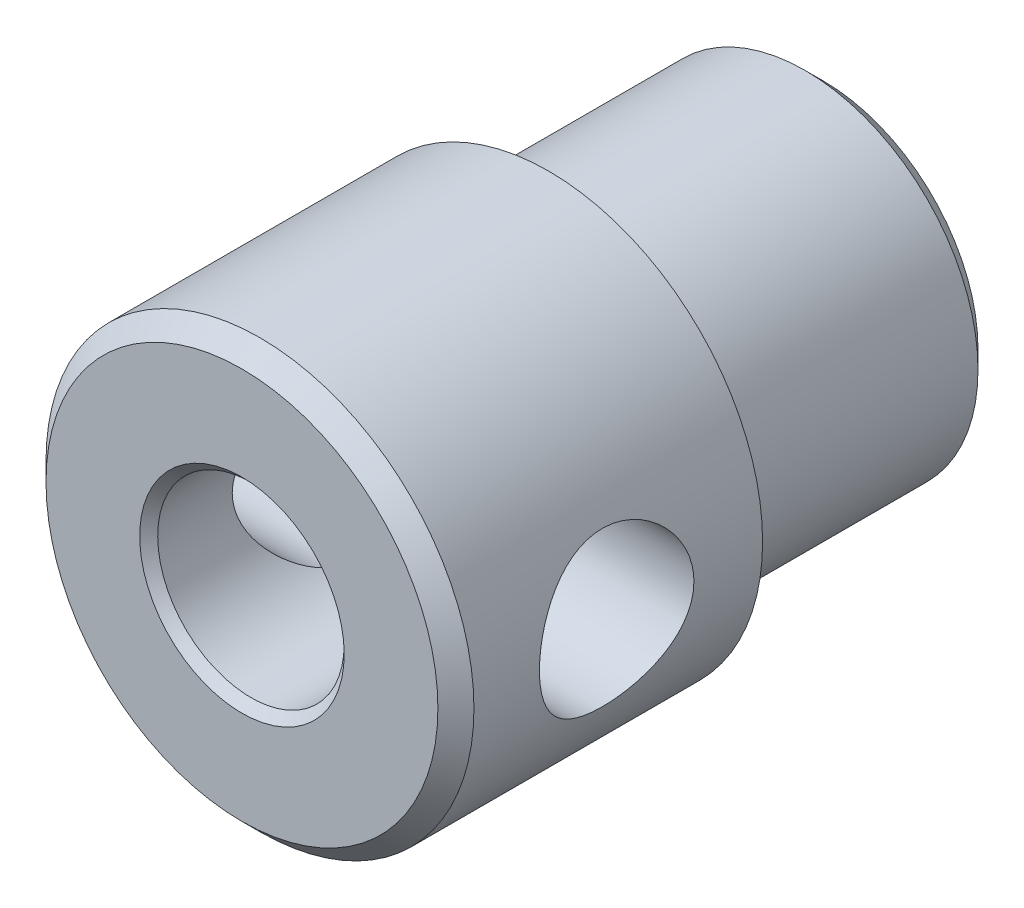
ISO-10303-21;
HEADER;
FILE_DESCRIPTION(('STEP AP214'),'2;1');
FILE_NAME('part.step','',(''),(''),'','','');
FILE_SCHEMA(('AUTOMOTIVE_DESIGN { 1 0 10303 214 1 1 1 1 }'));
ENDSEC;
DATA;
#1=APPLICATION_CONTEXT('core data for automotive mechanical design processes');
#2=APPLICATION_PROTOCOL_DEFINITION('international standard','automotive_design',2000,#1);
#3=PRODUCT_CONTEXT('',#1,'mechanical');
#4=PRODUCT('Part','Part','',(#3));
#5=PRODUCT_RELATED_PRODUCT_CATEGORY('part','',(#4));
#6=PRODUCT_DEFINITION_FORMATION('','',#4);
#7=PRODUCT_DEFINITION_CONTEXT('part definition',#1,'design');
#8=PRODUCT_DEFINITION('design','',#6,#7);
#9=PRODUCT_DEFINITION_SHAPE('','',#8);
#10=(LENGTH_UNIT() NAMED_UNIT(*) SI_UNIT(.MILLI.,.METRE.));
#11=(NAMED_UNIT(*) PLANE_ANGLE_UNIT() SI_UNIT($,.RADIAN.));
#12=(NAMED_UNIT(*) SI_UNIT($,.STERADIAN.) SOLID_ANGLE_UNIT());
#13=UNCERTAINTY_MEASURE_WITH_UNIT(LENGTH_MEASURE(1.E-05),#10,'distance_accuracy_value','');
#14=(GEOMETRIC_REPRESENTATION_CONTEXT(3) GLOBAL_UNCERTAINTY_ASSIGNED_CONTEXT((#13)) GLOBAL_UNIT_ASSIGNED_CONTEXT((#10,
#11,#12)) REPRESENTATION_CONTEXT('',''));
#15=CARTESIAN_POINT('',(0.,0.,0.));
#16=DIRECTION('',(0.,0.,1.));
#17=DIRECTION('',(1.,0.,0.));
#18=AXIS2_PLACEMENT_3D('',#15,#16,#17);
#19=CARTESIAN_POINT('',(0.,0.,0.));
#20=DIRECTION('',(0.,0.,1.));
#21=DIRECTION('',(1.,0.,0.));
#22=AXIS2_PLACEMENT_3D('',#19,#20,#21);
#23=PLANE('',#22);
#24=CARTESIAN_POINT('',(0.,0.,0.));
#25=DIRECTION('',(0.,0.,1.));
#26=DIRECTION('',(1.,0.,0.));
#27=AXIS2_PLACEMENT_3D('',#24,#25,#26);
#28=CIRCLE('',#27,4.7498);
#29=CARTESIAN_POINT('',(4.7498,0.,0.));
#30=VERTEX_POINT('',#29);
#31=EDGE_CURVE('E110',#30,#30,#28,.T.);
#32=ORIENTED_EDGE('',*,*,#31,.F.);
#33=EDGE_LOOP('',(#32));
#34=FACE_BOUND('',#33,.T.);
#35=CARTESIAN_POINT('',(0.,0.,0.));
#36=DIRECTION('',(0.,0.,1.));
#37=DIRECTION('',(1.,0.,0.));
#38=AXIS2_PLACEMENT_3D('',#35,#36,#37);
#39=CIRCLE('',#38,3.8354);
#40=CARTESIAN_POINT('',(3.8354,0.,0.));
#41=VERTEX_POINT('',#40);
#42=EDGE_CURVE('E113',#41,#41,#39,.F.);
#43=ORIENTED_EDGE('',*,*,#42,.F.);
#44=EDGE_LOOP('',(#43));
#45=FACE_BOUND('',#44,.T.);
#46=ADVANCED_FACE('F28',(#34,#45),#23,.F.);
#47=CARTESIAN_POINT('',(0.,0.,6.8072));
#48=DIRECTION('',(0.,0.,1.));
#49=DIRECTION('',(1.,0.,0.));
#50=AXIS2_PLACEMENT_3D('',#47,#48,#49);
#51=PLANE('',#50);
#52=CARTESIAN_POINT('',(0.,0.,6.8072));
#53=DIRECTION('',(0.,0.,1.));
#54=DIRECTION('',(1.,0.,0.));
#55=AXIS2_PLACEMENT_3D('',#52,#53,#54);
#56=CIRCLE('',#55,2.2701);
#57=CARTESIAN_POINT('',(2.2701,0.,6.8072));
#58=VERTEX_POINT('',#57);
#59=EDGE_CURVE('E10',#58,#58,#56,.F.);
#60=ORIENTED_EDGE('',*,*,#59,.T.);
#61=EDGE_LOOP('',(#60));
#62=FACE_BOUND('',#61,.T.);
#63=CARTESIAN_POINT('',(0.,0.,6.8072));
#64=DIRECTION('',(0.,0.,1.));
#65=DIRECTION('',(1.,0.,0.));
#66=AXIS2_PLACEMENT_3D('',#63,#64,#65);
#67=CIRCLE('',#66,4.3498);
#68=CARTESIAN_POINT('',(4.3498,0.,6.8072));
#69=VERTEX_POINT('',#68);
#70=EDGE_CURVE('E129',#69,#69,#67,.T.);
#71=ORIENTED_EDGE('',*,*,#70,.T.);
#72=EDGE_LOOP('',(#71));
#73=FACE_BOUND('',#72,.T.);
#74=ADVANCED_FACE('F82',(#62,#73),#51,.T.);
#75=CARTESIAN_POINT('',(0.,0.,6.8072));
#76=DIRECTION('',(0.,0.,-1.));
#77=DIRECTION('',(-1.,0.,0.));
#78=AXIS2_PLACEMENT_3D('',#75,#76,#77);
#79=CYLINDRICAL_SURFACE('',#78,4.7498);
#80=CARTESIAN_POINT('',(4.7498,0.,4.953));
#81=CARTESIAN_POINT('',(4.74980160663774,0.0930942396474775,4.95300221229045));
#82=CARTESIAN_POINT('',(4.74703875582867,0.18617283008039,4.94539365020771));
#83=CARTESIAN_POINT('',(4.73629183557048,0.369561868121523,4.91527299197296));
#84=CARTESIAN_POINT('',(4.72830808426181,0.459872484047846,4.89276180392537));
#85=CARTESIAN_POINT('',(4.70798005809533,0.635055022491523,4.83372658152392));
#86=CARTESIAN_POINT('',(4.69564381372382,0.71993662329139,4.79722834310159));
#87=CARTESIAN_POINT('',(4.6678499586273,0.882369383877246,4.71138120661523));
#88=CARTESIAN_POINT('',(4.65239158038028,0.959918734262041,4.66202914779874));
#89=CARTESIAN_POINT('',(4.61927264139657,1.10857111512231,4.54982030472378));
#90=CARTESIAN_POINT('',(4.60155298040043,1.17934316303242,4.48654262698213));
#91=CARTESIAN_POINT('',(4.56621100079752,1.30953283834024,4.34917254268915));
#92=CARTESIAN_POINT('',(4.5485887101768,1.36894735102747,4.27507717927451));
#93=CARTESIAN_POINT('',(4.51476240591564,1.47676362954703,4.11503039170027));
#94=CARTESIAN_POINT('',(4.49862895700857,1.52471095803208,4.02875644524995));
#95=CARTESIAN_POINT('',(4.47051931366728,1.60526978643708,3.84869403433341));
#96=CARTESIAN_POINT('',(4.4585415976259,1.63788690101634,3.75490833578335));
#97=CARTESIAN_POINT('',(4.44072806282671,1.685575169709,3.56628098353779));
#98=CARTESIAN_POINT('',(4.43467325418504,1.70127430542017,3.47161944360928));
#99=CARTESIAN_POINT('',(4.42874763394488,1.71664469812441,3.28082690471386));
#100=CARTESIAN_POINT('',(4.42887450346472,1.71632196526734,3.18469647028891));
#101=CARTESIAN_POINT('',(4.43510799895932,1.70014050270658,2.99929865296921));
#102=CARTESIAN_POINT('',(4.44088656486885,1.68513408471814,2.909943851293));
#103=CARTESIAN_POINT('',(4.45723007507367,1.64141374174676,2.73511831504673));
#104=CARTESIAN_POINT('',(4.46779568701267,1.61269790469717,2.64964812408895));
#105=CARTESIAN_POINT('',(4.49273265642839,1.54187530136123,2.48321214994163));
#106=CARTESIAN_POINT('',(4.50716912113282,1.49953670463679,2.40235519834594));
#107=CARTESIAN_POINT('',(4.53819753399574,1.40283167844309,2.24863856601929));
#108=CARTESIAN_POINT('',(4.55479018565329,1.34846131928326,2.17578150979084));
#109=CARTESIAN_POINT('',(4.5895154254715,1.22526920260998,2.03538898752783));
#110=CARTESIAN_POINT('',(4.60767975663085,1.15576119201204,1.96846215748653));
#111=CARTESIAN_POINT('',(4.64261331694962,1.00629297268734,1.84704149852377));
#112=CARTESIAN_POINT('',(4.65938236187086,0.926331387209101,1.79254930986309));
#113=CARTESIAN_POINT('',(4.68992706179116,0.756765307963341,1.69693867255926));
#114=CARTESIAN_POINT('',(4.70365964238195,0.667046061859523,1.65600900954076));
#115=CARTESIAN_POINT('',(4.72626732659488,0.48137787416138,1.59002155837774));
#116=CARTESIAN_POINT('',(4.73514442246544,0.385431505714702,1.56495725986871));
#117=CARTESIAN_POINT('',(4.74669772265443,0.195165645161939,1.5325498733017));
#118=CARTESIAN_POINT('',(4.7496607774948,0.101003177443279,1.52438625281436));
#119=CARTESIAN_POINT('',(4.74992945586649,-0.0873811118853077,1.52364080459701));
#120=CARTESIAN_POINT('',(4.74723622590538,-0.181602917597596,1.53105581913658));
#121=CARTESIAN_POINT('',(4.73668449771489,-0.36397719140117,1.56062384181684));
#122=CARTESIAN_POINT('',(4.72901033972851,-0.452226639157174,1.58225120540641));
#123=CARTESIAN_POINT('',(4.70945267117653,-0.623792019745317,1.63895014501451));
#124=CARTESIAN_POINT('',(4.69756861344624,-0.707107309636575,1.67402346866602));
#125=CARTESIAN_POINT('',(4.67035525759352,-0.869093226216648,1.75771143243853));
#126=CARTESIAN_POINT('',(4.65493747932404,-0.947563998447325,1.80668327667638));
#127=CARTESIAN_POINT('',(4.62237815721794,-1.09542761847779,1.91636932780871));
#128=CARTESIAN_POINT('',(4.60523601305696,-1.16481728528218,1.97708763097913));
#129=CARTESIAN_POINT('',(4.5699828768337,-1.29643678764391,2.11238363588412));
#130=CARTESIAN_POINT('',(4.55186925137085,-1.35808269406683,2.18753016688856));
#131=CARTESIAN_POINT('',(4.51762443201911,-1.46798957822296,2.34747176110171));
#132=CARTESIAN_POINT('',(4.50149335070925,-1.51624979604342,2.43226737170863));
#133=CARTESIAN_POINT('',(4.47314551026972,-1.59795275298085,2.60953804452431));
#134=CARTESIAN_POINT('',(4.46093532404276,-1.63137064630009,2.70202567814911));
#135=CARTESIAN_POINT('',(4.44211065196707,-1.68196188950211,2.89187267416414));
#136=CARTESIAN_POINT('',(4.43549304587579,-1.69914429820694,2.98922928786761));
#137=CARTESIAN_POINT('',(4.42899712227654,-1.71600063413867,3.17977654469465));
#138=CARTESIAN_POINT('',(4.42873917813892,-1.71666085625233,3.27286780693738));
#139=CARTESIAN_POINT('',(4.4340304670403,-1.70294648621771,3.45775913094712));
#140=CARTESIAN_POINT('',(4.43957922869914,-1.68857311447531,3.54955929691045));
#141=CARTESIAN_POINT('',(4.45555374602584,-1.64594491047578,3.72683801149011));
#142=CARTESIAN_POINT('',(4.46584803186857,-1.61806330956111,3.8124191371133));
#143=CARTESIAN_POINT('',(4.49008633884038,-1.54952878988044,3.9777454732427));
#144=CARTESIAN_POINT('',(4.5040312480379,-1.50887276306273,4.05748925768044));
#145=CARTESIAN_POINT('',(4.53485957035044,-1.41360188251683,4.21316690224719));
#146=CARTESIAN_POINT('',(4.55185431994537,-1.35839537148642,4.28871641023319));
#147=CARTESIAN_POINT('',(4.58645707656452,-1.2365352591289,4.42979558509342));
#148=CARTESIAN_POINT('',(4.60406526972774,-1.1698781587692,4.49532217759419));
#149=CARTESIAN_POINT('',(4.63893936339417,-1.02312828999518,4.61773241358451));
#150=CARTESIAN_POINT('',(4.65614698222236,-0.942539798564147,4.67404082633071));
#151=CARTESIAN_POINT('',(4.68736497205665,-0.77244840003899,4.77227836819816));
#152=CARTESIAN_POINT('',(4.70137548449718,-0.682945887537396,4.8142081334471));
#153=CARTESIAN_POINT('',(4.72474248989299,-0.496334029644709,4.88262745681826));
#154=CARTESIAN_POINT('',(4.73403920051399,-0.399144209529032,4.90891937866713));
#155=CARTESIAN_POINT('',(4.74656583775673,-0.201295866049881,4.94410087060838));
#156=CARTESIAN_POINT('',(4.74979826315703,-0.100638788782463,4.95299760842098));
#157=CARTESIAN_POINT('',(4.7498,0.,4.953));
#158=B_SPLINE_CURVE_WITH_KNOTS('',3,(#80,#81,#82,#83,#84,#85,#86,#87,#88,#89,#90,#91,#92,#93,
#94,#95,#96,#97,#98,#99,#100,#101,#102,#103,#104,#105,#106,#107,#108,#109,#110,#111,#112,#113,
#114,#115,#116,#117,#118,#119,#120,#121,#122,#123,#124,#125,#126,#127,#128,#129,#130,#131,#132,
#133,#134,#135,#136,#137,#138,#139,#140,#141,#142,#143,#144,#145,#146,#147,#148,#149,#150,#151,
#152,#153,#154,#155,#156,#157),.UNSPECIFIED.,.T.,.F.,(4,2,2,2,2,2,2,2,2,2,2,2,2,2,2,2,2,2,2,2,2,
2,2,2,2,2,2,2,2,2,2,2,2,2,2,2,2,2,4),(0.,0.278911798601302,0.557806603034673,0.836189505738407,
1.11464092749143,1.40307979110765,1.69159764357939,1.99014144677338,2.28857582354606,
2.57550441946898,2.86232538307575,3.13342911215752,3.40457066340383,3.6805949051014,
3.95670943240723,4.24991679153684,4.54316280549058,4.8403342216221,5.13738361404553,
5.41963650080937,5.70183218149989,5.97413748596849,6.24647819520995,6.52657506785086,
6.80676979372949,7.10199846968761,7.39724390250763,7.69298172532206,7.98855443935621,
8.26643789074482,8.54429878569862,8.81488597913558,9.08553905819933,9.36959798814955,
9.65374387478356,9.9517070531772,10.2496570476407,10.5512967509533,10.8528121368103),.UNSPECIFIED.);
#159=CARTESIAN_POINT('',(4.7498,0.,4.953));
#160=VERTEX_POINT('',#159);
#161=EDGE_CURVE('E73',#160,#160,#158,.T.);
#162=ORIENTED_EDGE('',*,*,#161,.T.);
#163=EDGE_LOOP('',(#162));
#164=FACE_BOUND('',#163,.T.);
#165=CARTESIAN_POINT('',(-4.7498,0.,4.953));
#166=CARTESIAN_POINT('',(-4.74980160663773,-0.0930942396474777,4.95300221229045));
#167=CARTESIAN_POINT('',(-4.74703875582867,-0.186172830080391,4.94539365020771));
#168=CARTESIAN_POINT('',(-4.73629183557048,-0.369561868121524,4.91527299197296));
#169=CARTESIAN_POINT('',(-4.72830808426181,-0.459872484047847,4.89276180392537));
#170=CARTESIAN_POINT('',(-4.70798005809533,-0.635055022491523,4.83372658152392));
#171=CARTESIAN_POINT('',(-4.69564381372382,-0.71993662329139,4.79722834310159));
#172=CARTESIAN_POINT('',(-4.6678499586273,-0.882369383877246,4.71138120661523));
#173=CARTESIAN_POINT('',(-4.65239158038028,-0.959918734262041,4.66202914779874));
#174=CARTESIAN_POINT('',(-4.61927264139657,-1.10857111512231,4.54982030472378));
#175=CARTESIAN_POINT('',(-4.60155298040043,-1.17934316303242,4.48654262698213));
#176=CARTESIAN_POINT('',(-4.56621100079752,-1.30953283834024,4.34917254268915));
#177=CARTESIAN_POINT('',(-4.5485887101768,-1.36894735102747,4.27507717927451));
#178=CARTESIAN_POINT('',(-4.51476240591564,-1.47676362954703,4.11503039170027));
#179=CARTESIAN_POINT('',(-4.49862895700857,-1.52471095803208,4.02875644524995));
#180=CARTESIAN_POINT('',(-4.47051931366728,-1.60526978643708,3.84869403433341));
#181=CARTESIAN_POINT('',(-4.4585415976259,-1.63788690101634,3.75490833578334));
#182=CARTESIAN_POINT('',(-4.44072806282671,-1.685575169709,3.56628098353779));
#183=CARTESIAN_POINT('',(-4.43467325418504,-1.70127430542017,3.47161944360928));
#184=CARTESIAN_POINT('',(-4.42874763394488,-1.71664469812441,3.28082690471386));
#185=CARTESIAN_POINT('',(-4.42887450346472,-1.71632196526734,3.18469647028891));
#186=CARTESIAN_POINT('',(-4.43510799895932,-1.70014050270658,2.99929865296921));
#187=CARTESIAN_POINT('',(-4.44088656486885,-1.68513408471814,2.909943851293));
#188=CARTESIAN_POINT('',(-4.45723007507367,-1.64141374174676,2.73511831504673));
#189=CARTESIAN_POINT('',(-4.46779568701267,-1.61269790469717,2.64964812408895));
#190=CARTESIAN_POINT('',(-4.49273265642839,-1.54187530136123,2.48321214994163));
#191=CARTESIAN_POINT('',(-4.50716912113282,-1.49953670463679,2.40235519834594));
#192=CARTESIAN_POINT('',(-4.53819753399574,-1.40283167844309,2.24863856601929));
#193=CARTESIAN_POINT('',(-4.55479018565329,-1.34846131928326,2.17578150979084));
#194=CARTESIAN_POINT('',(-4.5895154254715,-1.22526920260998,2.03538898752783));
#195=CARTESIAN_POINT('',(-4.60767975663085,-1.15576119201204,1.96846215748653));
#196=CARTESIAN_POINT('',(-4.64261331694962,-1.00629297268734,1.84704149852377));
#197=CARTESIAN_POINT('',(-4.65938236187086,-0.926331387209101,1.79254930986309));
#198=CARTESIAN_POINT('',(-4.68992706179116,-0.756765307963341,1.69693867255926));
#199=CARTESIAN_POINT('',(-4.70365964238195,-0.667046061859523,1.65600900954076));
#200=CARTESIAN_POINT('',(-4.72626732659488,-0.481377874161379,1.59002155837774));
#201=CARTESIAN_POINT('',(-4.73514442246544,-0.385431505714702,1.56495725986871));
#202=CARTESIAN_POINT('',(-4.74669772265443,-0.195165645161938,1.5325498733017));
#203=CARTESIAN_POINT('',(-4.7496607774948,-0.101003177443279,1.52438625281436));
#204=CARTESIAN_POINT('',(-4.74992945586649,0.0873811118853077,1.52364080459701));
#205=CARTESIAN_POINT('',(-4.74723622590538,0.181602917597597,1.53105581913658));
#206=CARTESIAN_POINT('',(-4.73668449771489,0.36397719140117,1.56062384181684));
#207=CARTESIAN_POINT('',(-4.72901033972851,0.452226639157174,1.58225120540641));
#208=CARTESIAN_POINT('',(-4.70945267117653,0.623792019745317,1.63895014501451));
#209=CARTESIAN_POINT('',(-4.69756861344624,0.707107309636575,1.67402346866602));
#210=CARTESIAN_POINT('',(-4.67035525759352,0.869093226216648,1.75771143243853));
#211=CARTESIAN_POINT('',(-4.65493747932404,0.947563998447326,1.80668327667638));
#212=CARTESIAN_POINT('',(-4.62237815721794,1.09542761847779,1.91636932780871));
#213=CARTESIAN_POINT('',(-4.60523601305696,1.16481728528218,1.97708763097913));
#214=CARTESIAN_POINT('',(-4.5699828768337,1.29643678764391,2.11238363588412));
#215=CARTESIAN_POINT('',(-4.55186925137085,1.35808269406683,2.18753016688856));
#216=CARTESIAN_POINT('',(-4.51762443201911,1.46798957822296,2.34747176110171));
#217=CARTESIAN_POINT('',(-4.50149335070925,1.51624979604342,2.43226737170863));
#218=CARTESIAN_POINT('',(-4.47314551026972,1.59795275298085,2.60953804452431));
#219=CARTESIAN_POINT('',(-4.46093532404276,1.63137064630009,2.70202567814911));
#220=CARTESIAN_POINT('',(-4.44211065196707,1.68196188950211,2.89187267416415));
#221=CARTESIAN_POINT('',(-4.43549304587579,1.69914429820694,2.98922928786761));
#222=CARTESIAN_POINT('',(-4.42899712227654,1.71600063413867,3.17977654469465));
#223=CARTESIAN_POINT('',(-4.42873917813892,1.71666085625233,3.27286780693738));
#224=CARTESIAN_POINT('',(-4.4340304670403,1.70294648621771,3.45775913094712));
#225=CARTESIAN_POINT('',(-4.43957922869914,1.68857311447531,3.54955929691045));
#226=CARTESIAN_POINT('',(-4.45555374602584,1.64594491047578,3.72683801149011));
#227=CARTESIAN_POINT('',(-4.46584803186857,1.61806330956111,3.8124191371133));
#228=CARTESIAN_POINT('',(-4.49008633884038,1.54952878988044,3.9777454732427));
#229=CARTESIAN_POINT('',(-4.50403124803791,1.50887276306273,4.05748925768044));
#230=CARTESIAN_POINT('',(-4.53485957035044,1.41360188251683,4.21316690224719));
#231=CARTESIAN_POINT('',(-4.55185431994537,1.35839537148642,4.28871641023319));
#232=CARTESIAN_POINT('',(-4.58645707656452,1.23653525912889,4.42979558509342));
#233=CARTESIAN_POINT('',(-4.60406526972774,1.1698781587692,4.49532217759419));
#234=CARTESIAN_POINT('',(-4.63893936339417,1.02312828999518,4.61773241358451));
#235=CARTESIAN_POINT('',(-4.65614698222236,0.942539798564148,4.67404082633071));
#236=CARTESIAN_POINT('',(-4.68736497205665,0.772448400038991,4.77227836819816));
#237=CARTESIAN_POINT('',(-4.70137548449718,0.682945887537397,4.8142081334471));
#238=CARTESIAN_POINT('',(-4.72474248989299,0.496334029644709,4.88262745681826));
#239=CARTESIAN_POINT('',(-4.73403920051399,0.399144209529033,4.90891937866713));
#240=CARTESIAN_POINT('',(-4.74656583775673,0.201295866049882,4.94410087060838));
#241=CARTESIAN_POINT('',(-4.74979826315703,0.100638788782463,4.95299760842098));
#242=CARTESIAN_POINT('',(-4.7498,0.,4.953));
#243=B_SPLINE_CURVE_WITH_KNOTS('',3,(#165,#166,#167,#168,#169,#170,#171,#172,#173,#174,#175,
#176,#177,#178,#179,#180,#181,#182,#183,#184,#185,#186,#187,#188,#189,#190,#191,#192,#193,#194,
#195,#196,#197,#198,#199,#200,#201,#202,#203,#204,#205,#206,#207,#208,#209,#210,#211,#212,#213,
#214,#215,#216,#217,#218,#219,#220,#221,#222,#223,#224,#225,#226,#227,#228,#229,#230,#231,#232,
#233,#234,#235,#236,#237,#238,#239,#240,#241,#242),.UNSPECIFIED.,.T.,.F.,(4,2,2,2,2,2,2,2,2,2,2,
2,2,2,2,2,2,2,2,2,2,2,2,2,2,2,2,2,2,2,2,2,2,2,2,2,2,2,4),(0.,0.278911798601302,
0.557806603034673,0.836189505738407,1.11464092749143,1.40307979110765,1.69159764357939,
1.99014144677338,2.28857582354606,2.57550441946898,2.86232538307575,3.13342911215752,
3.40457066340383,3.6805949051014,3.95670943240723,4.24991679153684,4.54316280549058,
4.8403342216221,5.13738361404553,5.41963650080937,5.70183218149989,5.97413748596849,
6.24647819520995,6.52657506785086,6.80676979372949,7.10199846968761,7.39724390250763,
7.69298172532206,7.98855443935621,8.26643789074482,8.54429878569862,8.81488597913558,
9.08553905819933,9.36959798814956,9.65374387478356,9.9517070531772,10.2496570476407,
10.5512967509533,10.8528121368103),.UNSPECIFIED.);
#244=CARTESIAN_POINT('',(-4.7498,0.,4.953));
#245=VERTEX_POINT('',#244);
#246=EDGE_CURVE('E68',#245,#245,#243,.T.);
#247=ORIENTED_EDGE('',*,*,#246,.T.);
#248=EDGE_LOOP('',(#247));
#249=FACE_BOUND('',#248,.T.);
#250=CARTESIAN_POINT('',(0.,0.,6.4072));
#251=DIRECTION('',(0.,0.,1.));
#252=DIRECTION('',(1.,0.,0.));
#253=AXIS2_PLACEMENT_3D('',#250,#251,#252);
#254=CIRCLE('',#253,4.7498);
#255=CARTESIAN_POINT('',(4.7498,0.,6.4072));
#256=VERTEX_POINT('',#255);
#257=EDGE_CURVE('E45',#256,#256,#254,.F.);
#258=ORIENTED_EDGE('',*,*,#257,.T.);
#259=EDGE_LOOP('',(#258));
#260=FACE_BOUND('',#259,.T.);
#261=ORIENTED_EDGE('',*,*,#31,.T.);
#262=EDGE_LOOP('',(#261));
#263=FACE_BOUND('',#262,.T.);
#264=ADVANCED_FACE('F77',(#164,#249,#260,#263),#79,.T.);
#265=CARTESIAN_POINT('',(0.,0.,6.8072));
#266=DIRECTION('',(0.,0.,-1.));
#267=DIRECTION('',(-1.,0.,0.));
#268=AXIS2_PLACEMENT_3D('',#265,#266,#267);
#269=CYLINDRICAL_SURFACE('',#268,2.0701);
#270=CARTESIAN_POINT('',(-2.0701,0.,4.953));
#271=CARTESIAN_POINT('',(-2.07009418938478,-0.0815580369511777,4.95299404803894));
#272=CARTESIAN_POINT('',(-2.06523519560094,-0.163171139730416,4.94713588252077));
#273=CARTESIAN_POINT('',(-2.04623783438179,-0.323702168267275,4.92412330481102));
#274=CARTESIAN_POINT('',(-2.03208869034249,-0.402616851865802,4.90695577364234));
#275=CARTESIAN_POINT('',(-1.99583140109565,-0.555044861603098,4.8626002587477));
#276=CARTESIAN_POINT('',(-1.97377202229855,-0.628588030276815,4.83547364861032));
#277=CARTESIAN_POINT('',(-1.92324596466761,-0.769448756193531,4.77258594030526));
#278=CARTESIAN_POINT('',(-1.89477761988957,-0.836764688300361,4.73682259693233));
#279=CARTESIAN_POINT('',(-1.82177708487292,-0.987828394734146,4.64356359646851));
#280=CARTESIAN_POINT('',(-1.77517228356096,-1.0686195341754,4.58289836092134));
#281=CARTESIAN_POINT('',(-1.67696463662667,-1.21698911821728,4.45027736287163));
#282=CARTESIAN_POINT('',(-1.62534796640755,-1.28452936967029,4.37829001059099));
#283=CARTESIAN_POINT('',(-1.52030463096568,-1.40733359677713,4.22283763998196));
#284=CARTESIAN_POINT('',(-1.4668621140309,-1.4623534847805,4.1391886042215));
#285=CARTESIAN_POINT('',(-1.39048341016693,-1.53398193356989,4.00592179528994));
#286=CARTESIAN_POINT('',(-1.36567222337876,-1.55602847834706,3.96023856652011));
#287=CARTESIAN_POINT('',(-1.31834668666745,-1.59631962188077,3.86611033379157));
#288=CARTESIAN_POINT('',(-1.295830377538,-1.61456747780735,3.81766774161598));
#289=CARTESIAN_POINT('',(-1.25230074687403,-1.64860446303975,3.71279235617987));
#290=CARTESIAN_POINT('',(-1.23167523651989,-1.66395270133961,3.65604863579314));
#291=CARTESIAN_POINT('',(-1.19718754296087,-1.68893882904099,3.53939374078013));
#292=CARTESIAN_POINT('',(-1.18330872077377,-1.69859077960805,3.47949076670181));
#293=CARTESIAN_POINT('',(-1.16452141226044,-1.71153385340596,3.35680177484519));
#294=CARTESIAN_POINT('',(-1.1597187235966,-1.71474998139527,3.29399039452668));
#295=CARTESIAN_POINT('',(-1.16050254117614,-1.71421915264498,3.1684604191334));
#296=CARTESIAN_POINT('',(-1.16609101071414,-1.71047088005888,3.10574184383384));
#297=CARTESIAN_POINT('',(-1.18738415014224,-1.69576013346638,2.97670858589062));
#298=CARTESIAN_POINT('',(-1.20401332125008,-1.68413615750911,2.91063123987495));
#299=CARTESIAN_POINT('',(-1.24500159660723,-1.65406424814516,2.78249428512536));
#300=CARTESIAN_POINT('',(-1.26938585127607,-1.63559407922326,2.72044855093797));
#301=CARTESIAN_POINT('',(-1.33815646944179,-1.58035724137797,2.5661500585129));
#302=CARTESIAN_POINT('',(-1.38598216380424,-1.53917672505333,2.4770413007073));
#303=CARTESIAN_POINT('',(-1.48529491435877,-1.44361125698871,2.30850463212284));
#304=CARTESIAN_POINT('',(-1.53678823182542,-1.38920332226555,2.22909393674447));
#305=CARTESIAN_POINT('',(-1.64104893788307,-1.26459053571469,2.07639989033113));
#306=CARTESIAN_POINT('',(-1.69376103076843,-1.19375917060744,2.0035853677801));
#307=CARTESIAN_POINT('',(-1.79339264363732,-1.03805968161879,1.87014249932235));
#308=CARTESIAN_POINT('',(-1.84032518086004,-0.953224147550528,1.80948656769111));
#309=CARTESIAN_POINT('',(-1.91343114413117,-0.793551024156763,1.71665807845753));
#310=CARTESIAN_POINT('',(-1.94184680190076,-0.721675704038395,1.68116606829226));
#311=CARTESIAN_POINT('',(-1.99123392332819,-0.571433753732733,1.62000192280984));
#312=CARTESIAN_POINT('',(-2.0122103045269,-0.49307145401448,1.59432329973338));
#313=CARTESIAN_POINT('',(-2.04514392812619,-0.331023745674534,1.55417728745642));
#314=CARTESIAN_POINT('',(-2.05703553087087,-0.247304246628482,1.53979147128599));
#315=CARTESIAN_POINT('',(-2.07037742801581,-0.0778392988652681,1.52365866222686));
#316=CARTESIAN_POINT('',(-2.07183365325841,0.00790497128573261,1.52190449026685));
#317=CARTESIAN_POINT('',(-2.0646159394388,0.168530872370913,1.53062462468628));
#318=CARTESIAN_POINT('',(-2.0570689734849,0.243544365876418,1.53973847493388));
#319=CARTESIAN_POINT('',(-2.03428058610309,0.390580875732637,1.56740601204852));
#320=CARTESIAN_POINT('',(-2.01903805202802,0.462603458018775,1.58596106395443));
#321=CARTESIAN_POINT('',(-1.98151307176651,0.603628009168871,1.63202154439997));
#322=CARTESIAN_POINT('',(-1.95908165174643,0.672527229351336,1.65971678194685));
#323=CARTESIAN_POINT('',(-1.90867851838305,0.804526362700314,1.72271480028083));
#324=CARTESIAN_POINT('',(-1.88070491207928,0.867624283594508,1.75802018071242));
#325=CARTESIAN_POINT('',(-1.80701922643202,1.01462302476548,1.85258424959335));
#326=CARTESIAN_POINT('',(-1.75900090034249,1.09505278124564,1.91546057380839));
#327=CARTESIAN_POINT('',(-1.65827752130073,1.24235272009269,2.05263989478258));
#328=CARTESIAN_POINT('',(-1.60555696637265,1.30917547461424,2.12698132367831));
#329=CARTESIAN_POINT('',(-1.49889022645464,1.43010614791817,2.2874036756018));
#330=CARTESIAN_POINT('',(-1.4449388481007,1.48396846918569,2.3736688616446));
#331=CARTESIAN_POINT('',(-1.36873434170371,1.55340751393281,2.51114195211375));
#332=CARTESIAN_POINT('',(-1.34414563521626,1.57464344368748,2.55825310651899));
#333=CARTESIAN_POINT('',(-1.2977100233142,1.61312297464762,2.65534424103318));
#334=CARTESIAN_POINT('',(-1.27586022815039,1.63037080010397,2.70532111503541));
#335=CARTESIAN_POINT('',(-1.23520200526035,1.66141063268962,2.81135284305366));
#336=CARTESIAN_POINT('',(-1.21665690192395,1.67493106918265,2.86759248280295));
#337=CARTESIAN_POINT('',(-1.18661970455363,1.69634725782809,2.98289054737814));
#338=CARTESIAN_POINT('',(-1.17510919175502,1.70425770748438,3.04194117085889));
#339=CARTESIAN_POINT('',(-1.16105052153048,1.71387248728466,3.16224559309854));
#340=CARTESIAN_POINT('',(-1.15858842525941,1.71551722848721,3.2235149785563));
#341=CARTESIAN_POINT('',(-1.16341148697738,1.71224770519792,3.34550987383901));
#342=CARTESIAN_POINT('',(-1.17070512736142,1.70732773284344,3.40623486408932));
#343=CARTESIAN_POINT('',(-1.19548536141008,1.69008312220672,3.53525002931979));
#344=CARTESIAN_POINT('',(-1.21448505655357,1.6766485018203,3.60308635468474));
#345=CARTESIAN_POINT('',(-1.26008666504241,1.64265124626134,3.73431490964614));
#346=CARTESIAN_POINT('',(-1.28671309463557,1.62206557779045,3.79769197305907));
#347=CARTESIAN_POINT('',(-1.36083218981207,1.56104500428089,3.9549559537783));
#348=CARTESIAN_POINT('',(-1.41153844298498,1.51599556680172,4.04551414682248));
#349=CARTESIAN_POINT('',(-1.51574314102706,1.41184984231677,4.21635622585));
#350=CARTESIAN_POINT('',(-1.56924602049726,1.35273068311731,4.29662305146902));
#351=CARTESIAN_POINT('',(-1.67601209250198,1.2181770116514,4.44940490677599));
#352=CARTESIAN_POINT('',(-1.72919236044834,1.14221746779262,4.5215205946425));
#353=CARTESIAN_POINT('',(-1.8283670751001,0.975570790326037,4.65233205162652));
#354=CARTESIAN_POINT('',(-1.87437989882256,0.884922578785115,4.71106232581612));
#355=CARTESIAN_POINT('',(-1.94277144607488,0.71868418332276,4.79702932908098));
#356=CARTESIAN_POINT('',(-1.96812372094861,0.646476414738114,4.82845077717993));
#357=CARTESIAN_POINT('',(-2.01119974106822,0.496432569108501,4.8814736207042));
#358=CARTESIAN_POINT('',(-2.02893741011417,0.418607071607692,4.90309294405144));
#359=CARTESIAN_POINT('',(-2.05133898637723,0.28367646620988,4.93031140346692));
#360=CARTESIAN_POINT('',(-2.0583429514219,0.227522697003811,4.93878883648185));
#361=CARTESIAN_POINT('',(-2.06772587979403,0.114255067626772,4.95013568787582));
#362=CARTESIAN_POINT('',(-2.07010407102304,0.0571410487827379,4.95300417005252));
#363=CARTESIAN_POINT('',(-2.0701,0.,4.953));
#364=B_SPLINE_CURVE_WITH_KNOTS('',3,(#270,#271,#272,#273,#274,#275,#276,#277,#278,#279,#280,
#281,#282,#283,#284,#285,#286,#287,#288,#289,#290,#291,#292,#293,#294,#295,#296,#297,#298,#299,
#300,#301,#302,#303,#304,#305,#306,#307,#308,#309,#310,#311,#312,#313,#314,#315,#316,#317,#318,
#319,#320,#321,#322,#323,#324,#325,#326,#327,#328,#329,#330,#331,#332,#333,#334,#335,#336,#337,
#338,#339,#340,#341,#342,#343,#344,#345,#346,#347,#348,#349,#350,#351,#352,#353,#354,#355,#356,
#357,#358,#359,#360,#361,#362,#363),.UNSPECIFIED.,.T.,.F.,(4,2,2,2,2,2,2,2,2,2,2,2,2,2,2,2,2,2,
2,2,2,2,2,2,2,2,2,2,2,2,2,2,2,2,2,2,2,2,2,2,2,2,2,2,2,2,4),(0.,0.244430693618739,
0.489145429750837,0.732376735406756,0.97567133966893,1.30766493506959,1.64060181639471,
1.97955943145158,2.14877954824563,2.31785396480626,2.50418081459613,2.6900457755919,
2.8780642544762,3.06611826098614,3.27232632735016,3.47921008356106,3.80504781807999,
4.13145580197903,4.47333494078929,4.814429410293,5.06859284704432,5.32258796111823,
5.57840133286353,5.83406930410031,6.06082438449428,6.28761225917649,6.51944195036369,
6.75135096103376,7.08797278595674,7.42574856195594,7.76949423329966,7.94097115199394,
8.11226559950527,8.2939036458035,8.47506404606536,8.65794310136624,8.84098126932634,
9.05492461162905,9.2695635479388,9.60720253177297,9.94539418745959,10.2961640730629,
10.6460192467897,10.8932533402904,11.1400334043949,11.3112574312462,11.4825100350383),.UNSPECIFIED.);
#365=CARTESIAN_POINT('',(-2.0701,0.,4.953));
#366=VERTEX_POINT('',#365);
#367=EDGE_CURVE('E32',#366,#366,#364,.T.);
#368=ORIENTED_EDGE('',*,*,#367,.F.);
#369=EDGE_LOOP('',(#368));
#370=FACE_BOUND('',#369,.T.);
#371=CARTESIAN_POINT('',(2.0701,0.,4.953));
#372=CARTESIAN_POINT('',(2.07009418938478,0.0815580369511775,4.95299404803894));
#373=CARTESIAN_POINT('',(2.06523519560094,0.163171139730415,4.94713588252077));
#374=CARTESIAN_POINT('',(2.04623783438179,0.323702168267274,4.92412330481102));
#375=CARTESIAN_POINT('',(2.03208869034249,0.402616851865802,4.90695577364234));
#376=CARTESIAN_POINT('',(1.99583140109565,0.555044861603097,4.8626002587477));
#377=CARTESIAN_POINT('',(1.97377202229855,0.628588030276814,4.83547364861032));
#378=CARTESIAN_POINT('',(1.92324596466761,0.76944875619353,4.77258594030526));
#379=CARTESIAN_POINT('',(1.89477761988957,0.83676468830036,4.73682259693233));
#380=CARTESIAN_POINT('',(1.82177708487292,0.987828394734145,4.64356359646851));
#381=CARTESIAN_POINT('',(1.77517228356096,1.0686195341754,4.58289836092134));
#382=CARTESIAN_POINT('',(1.67696463662667,1.21698911821728,4.45027736287163));
#383=CARTESIAN_POINT('',(1.62534796640755,1.28452936967028,4.37829001059099));
#384=CARTESIAN_POINT('',(1.52030463096568,1.40733359677713,4.22283763998196));
#385=CARTESIAN_POINT('',(1.4668621140309,1.4623534847805,4.1391886042215));
#386=CARTESIAN_POINT('',(1.39048341016693,1.53398193356989,4.00592179528994));
#387=CARTESIAN_POINT('',(1.36567222337876,1.55602847834706,3.96023856652012));
#388=CARTESIAN_POINT('',(1.31834668666745,1.59631962188077,3.86611033379158));
#389=CARTESIAN_POINT('',(1.295830377538,1.61456747780735,3.81766774161599));
#390=CARTESIAN_POINT('',(1.25230074687404,1.64860446303975,3.71279235617987));
#391=CARTESIAN_POINT('',(1.23167523651989,1.66395270133961,3.65604863579315));
#392=CARTESIAN_POINT('',(1.19718754296087,1.68893882904099,3.53939374078014));
#393=CARTESIAN_POINT('',(1.18330872077377,1.69859077960805,3.47949076670182));
#394=CARTESIAN_POINT('',(1.16452141226044,1.71153385340596,3.35680177484519));
#395=CARTESIAN_POINT('',(1.1597187235966,1.71474998139527,3.29399039452668));
#396=CARTESIAN_POINT('',(1.16050254117614,1.71421915264498,3.1684604191334));
#397=CARTESIAN_POINT('',(1.16609101071414,1.71047088005888,3.10574184383384));
#398=CARTESIAN_POINT('',(1.18738415014224,1.69576013346638,2.97670858589062));
#399=CARTESIAN_POINT('',(1.20401332125008,1.68413615750911,2.91063123987495));
#400=CARTESIAN_POINT('',(1.24500159660723,1.65406424814516,2.78249428512536));
#401=CARTESIAN_POINT('',(1.26938585127607,1.63559407922326,2.72044855093797));
#402=CARTESIAN_POINT('',(1.33815646944179,1.58035724137797,2.5661500585129));
#403=CARTESIAN_POINT('',(1.38598216380424,1.53917672505333,2.4770413007073));
#404=CARTESIAN_POINT('',(1.48529491435877,1.44361125698871,2.30850463212284));
#405=CARTESIAN_POINT('',(1.53678823182542,1.38920332226556,2.22909393674447));
#406=CARTESIAN_POINT('',(1.64104893788307,1.26459053571469,2.07639989033113));
#407=CARTESIAN_POINT('',(1.69376103076843,1.19375917060744,2.0035853677801));
#408=CARTESIAN_POINT('',(1.79339264363732,1.03805968161879,1.87014249932235));
#409=CARTESIAN_POINT('',(1.84032518086004,0.953224147550528,1.80948656769111));
#410=CARTESIAN_POINT('',(1.91343114413117,0.793551024156764,1.71665807845753));
#411=CARTESIAN_POINT('',(1.94184680190076,0.721675704038396,1.68116606829226));
#412=CARTESIAN_POINT('',(1.99123392332819,0.571433753732734,1.62000192280984));
#413=CARTESIAN_POINT('',(2.0122103045269,0.493071454014481,1.59432329973338));
#414=CARTESIAN_POINT('',(2.04514392812619,0.331023745674535,1.55417728745642));
#415=CARTESIAN_POINT('',(2.05703553087087,0.247304246628482,1.53979147128599));
#416=CARTESIAN_POINT('',(2.07037742801581,0.0778392988652685,1.52365866222686));
#417=CARTESIAN_POINT('',(2.07183365325841,-0.00790497128573222,1.52190449026685));
#418=CARTESIAN_POINT('',(2.0646159394388,-0.168530872370912,1.53062462468628));
#419=CARTESIAN_POINT('',(2.0570689734849,-0.243544365876418,1.53973847493388));
#420=CARTESIAN_POINT('',(2.03428058610309,-0.390580875732636,1.56740601204852));
#421=CARTESIAN_POINT('',(2.01903805202802,-0.462603458018775,1.58596106395443));
#422=CARTESIAN_POINT('',(1.98151307176651,-0.60362800916887,1.63202154439997));
#423=CARTESIAN_POINT('',(1.95908165174643,-0.672527229351336,1.65971678194685));
#424=CARTESIAN_POINT('',(1.90867851838305,-0.804526362700313,1.72271480028083));
#425=CARTESIAN_POINT('',(1.88070491207928,-0.867624283594507,1.75802018071242));
#426=CARTESIAN_POINT('',(1.80701922643202,-1.01462302476548,1.85258424959335));
#427=CARTESIAN_POINT('',(1.75900090034249,-1.09505278124564,1.91546057380839));
#428=CARTESIAN_POINT('',(1.65827752130073,-1.24235272009269,2.05263989478258));
#429=CARTESIAN_POINT('',(1.60555696637265,-1.30917547461424,2.12698132367831));
#430=CARTESIAN_POINT('',(1.49889022645464,-1.43010614791816,2.2874036756018));
#431=CARTESIAN_POINT('',(1.4449388481007,-1.48396846918569,2.3736688616446));
#432=CARTESIAN_POINT('',(1.36873434170371,-1.55340751393281,2.51114195211375));
#433=CARTESIAN_POINT('',(1.34414563521626,-1.57464344368748,2.55825310651899));
#434=CARTESIAN_POINT('',(1.2977100233142,-1.61312297464762,2.65534424103318));
#435=CARTESIAN_POINT('',(1.27586022815039,-1.63037080010397,2.70532111503541));
#436=CARTESIAN_POINT('',(1.23520200526035,-1.66141063268962,2.81135284305366));
#437=CARTESIAN_POINT('',(1.21665690192395,-1.67493106918265,2.86759248280295));
#438=CARTESIAN_POINT('',(1.18661970455364,-1.69634725782809,2.98289054737814));
#439=CARTESIAN_POINT('',(1.17510919175503,-1.70425770748438,3.04194117085889));
#440=CARTESIAN_POINT('',(1.16105052153048,-1.71387248728466,3.16224559309854));
#441=CARTESIAN_POINT('',(1.15858842525941,-1.71551722848721,3.2235149785563));
#442=CARTESIAN_POINT('',(1.16341148697738,-1.71224770519792,3.34550987383901));
#443=CARTESIAN_POINT('',(1.17070512736142,-1.70732773284344,3.40623486408932));
#444=CARTESIAN_POINT('',(1.19548536141008,-1.69008312220672,3.53525002931979));
#445=CARTESIAN_POINT('',(1.21448505655357,-1.6766485018203,3.60308635468475));
#446=CARTESIAN_POINT('',(1.26008666504241,-1.64265124626134,3.73431490964614));
#447=CARTESIAN_POINT('',(1.28671309463557,-1.62206557779045,3.79769197305907));
#448=CARTESIAN_POINT('',(1.36083218981207,-1.56104500428089,3.9549559537783));
#449=CARTESIAN_POINT('',(1.41153844298498,-1.51599556680172,4.04551414682248));
#450=CARTESIAN_POINT('',(1.51574314102706,-1.41184984231677,4.21635622585));
#451=CARTESIAN_POINT('',(1.56924602049727,-1.35273068311731,4.29662305146903));
#452=CARTESIAN_POINT('',(1.67601209250198,-1.2181770116514,4.44940490677599));
#453=CARTESIAN_POINT('',(1.72919236044834,-1.14221746779262,4.5215205946425));
#454=CARTESIAN_POINT('',(1.8283670751001,-0.975570790326036,4.65233205162652));
#455=CARTESIAN_POINT('',(1.87437989882256,-0.884922578785114,4.71106232581612));
#456=CARTESIAN_POINT('',(1.94277144607488,-0.718684183322758,4.79702932908098));
#457=CARTESIAN_POINT('',(1.96812372094861,-0.646476414738112,4.82845077717993));
#458=CARTESIAN_POINT('',(2.01119974106822,-0.496432569108499,4.8814736207042));
#459=CARTESIAN_POINT('',(2.02893741011417,-0.418607071607691,4.90309294405144));
#460=CARTESIAN_POINT('',(2.05133898637723,-0.283676466209879,4.93031140346692));
#461=CARTESIAN_POINT('',(2.0583429514219,-0.22752269700381,4.93878883648185));
#462=CARTESIAN_POINT('',(2.06772587979403,-0.114255067626772,4.95013568787582));
#463=CARTESIAN_POINT('',(2.07010407102305,-0.0571410487827377,4.95300417005252));
#464=CARTESIAN_POINT('',(2.0701,0.,4.953));
#465=B_SPLINE_CURVE_WITH_KNOTS('',3,(#371,#372,#373,#374,#375,#376,#377,#378,#379,#380,#381,
#382,#383,#384,#385,#386,#387,#388,#389,#390,#391,#392,#393,#394,#395,#396,#397,#398,#399,#400,
#401,#402,#403,#404,#405,#406,#407,#408,#409,#410,#411,#412,#413,#414,#415,#416,#417,#418,#419,
#420,#421,#422,#423,#424,#425,#426,#427,#428,#429,#430,#431,#432,#433,#434,#435,#436,#437,#438,
#439,#440,#441,#442,#443,#444,#445,#446,#447,#448,#449,#450,#451,#452,#453,#454,#455,#456,#457,
#458,#459,#460,#461,#462,#463,#464),.UNSPECIFIED.,.T.,.F.,(4,2,2,2,2,2,2,2,2,2,2,2,2,2,2,2,2,2,
2,2,2,2,2,2,2,2,2,2,2,2,2,2,2,2,2,2,2,2,2,2,2,2,2,2,2,2,4),(0.,0.244430693618738,
0.489145429750836,0.732376735406755,0.975671339668929,1.30766493506959,1.64060181639471,
1.97955943145158,2.14877954824563,2.31785396480626,2.50418081459613,2.6900457755919,
2.8780642544762,3.06611826098614,3.27232632735016,3.47921008356106,3.80504781807999,
4.13145580197903,4.47333494078929,4.814429410293,5.06859284704431,5.32258796111823,
5.57840133286353,5.83406930410031,6.06082438449429,6.28761225917649,6.51944195036369,
6.75135096103376,7.08797278595674,7.42574856195594,7.76949423329966,7.94097115199394,
8.11226559950527,8.2939036458035,8.47506404606536,8.65794310136624,8.84098126932635,
9.05492461162906,9.2695635479388,9.60720253177298,9.9453941874596,10.2961640730629,
10.6460192467897,10.8932533402904,11.1400334043949,11.3112574312462,11.4825100350383),.UNSPECIFIED.);
#466=CARTESIAN_POINT('',(2.0701,0.,4.953));
#467=VERTEX_POINT('',#466);
#468=EDGE_CURVE('E48',#467,#467,#465,.T.);
#469=ORIENTED_EDGE('',*,*,#468,.F.);
#470=EDGE_LOOP('',(#469));
#471=FACE_BOUND('',#470,.T.);
#472=CARTESIAN_POINT('',(0.,0.,6.6072));
#473=DIRECTION('',(0.,0.,1.));
#474=DIRECTION('',(1.,0.,0.));
#475=AXIS2_PLACEMENT_3D('',#472,#473,#474);
#476=CIRCLE('',#475,2.0701);
#477=CARTESIAN_POINT('',(2.0701,0.,6.6072));
#478=VERTEX_POINT('',#477);
#479=EDGE_CURVE('E40',#478,#478,#476,.T.);
#480=ORIENTED_EDGE('',*,*,#479,.T.);
#481=EDGE_LOOP('',(#480));
#482=FACE_BOUND('',#481,.T.);
#483=CARTESIAN_POINT('',(0.,0.,-5.896));
#484=DIRECTION('',(0.,0.,-1.));
#485=DIRECTION('',(-1.,0.,0.));
#486=AXIS2_PLACEMENT_3D('',#483,#484,#485);
#487=CIRCLE('',#486,2.0701);
#488=CARTESIAN_POINT('',(-2.0701,0.,-5.896));
#489=VERTEX_POINT('',#488);
#490=EDGE_CURVE('E115',#489,#489,#487,.T.);
#491=ORIENTED_EDGE('',*,*,#490,.T.);
#492=EDGE_LOOP('',(#491));
#493=FACE_BOUND('',#492,.T.);
#494=ADVANCED_FACE('F52',(#370,#471,#482,#493),#269,.F.);
#495=CARTESIAN_POINT('',(0.,0.,-6.096));
#496=DIRECTION('',(0.,0.,-1.));
#497=DIRECTION('',(-1.,0.,0.));
#498=AXIS2_PLACEMENT_3D('',#495,#496,#497);
#499=PLANE('',#498);
#500=CARTESIAN_POINT('',(0.,0.,-6.096));
#501=DIRECTION('',(0.,0.,-1.));
#502=DIRECTION('',(-1.,0.,0.));
#503=AXIS2_PLACEMENT_3D('',#500,#501,#502);
#504=CIRCLE('',#503,3.43540000000001);
#505=CARTESIAN_POINT('',(-3.43540000000001,0.,-6.096));
#506=VERTEX_POINT('',#505);
#507=EDGE_CURVE('E123',#506,#506,#504,.T.);
#508=ORIENTED_EDGE('',*,*,#507,.T.);
#509=EDGE_LOOP('',(#508));
#510=FACE_BOUND('',#509,.T.);
#511=CARTESIAN_POINT('',(0.,0.,-6.096));
#512=DIRECTION('',(0.,0.,-1.));
#513=DIRECTION('',(-1.,0.,0.));
#514=AXIS2_PLACEMENT_3D('',#511,#512,#513);
#515=CIRCLE('',#514,2.2701);
#516=CARTESIAN_POINT('',(-2.2701,0.,-6.096));
#517=VERTEX_POINT('',#516);
#518=EDGE_CURVE('E118',#517,#517,#515,.F.);
#519=ORIENTED_EDGE('',*,*,#518,.T.);
#520=EDGE_LOOP('',(#519));
#521=FACE_BOUND('',#520,.T.);
#522=ADVANCED_FACE('F62',(#510,#521),#499,.T.);
#523=CARTESIAN_POINT('',(0.,0.,-6.096));
#524=DIRECTION('',(0.,0.,1.));
#525=DIRECTION('',(1.,0.,0.));
#526=AXIS2_PLACEMENT_3D('',#523,#524,#525);
#527=CYLINDRICAL_SURFACE('',#526,3.8354);
#528=CARTESIAN_POINT('',(0.,0.,-5.69600000000001));
#529=DIRECTION('',(0.,0.,-1.));
#530=DIRECTION('',(-1.,0.,0.));
#531=AXIS2_PLACEMENT_3D('',#528,#529,#530);
#532=CIRCLE('',#531,3.8354);
#533=CARTESIAN_POINT('',(3.8354,0.,-5.69600000000001));
#534=VERTEX_POINT('',#533);
#535=EDGE_CURVE('E126',#534,#534,#532,.F.);
#536=CARTESIAN_POINT('',(3.8354,0.,-5.69600000000001));
#537=CARTESIAN_POINT('',(3.8354,0.,-5.63666666666668));
#538=CARTESIAN_POINT('',(3.8354,0.,-5.57733333333334));
#539=CARTESIAN_POINT('',(3.8354,0.,-5.45866666666667));
#540=CARTESIAN_POINT('',(3.8354,0.,-5.39933333333334));
#541=CARTESIAN_POINT('',(3.8354,0.,-5.28066666666667));
#542=CARTESIAN_POINT('',(3.8354,0.,-5.22133333333334));
#543=CARTESIAN_POINT('',(3.8354,0.,-5.10266666666667));
#544=CARTESIAN_POINT('',(3.8354,0.,-5.04333333333334));
#545=CARTESIAN_POINT('',(3.8354,0.,-4.92466666666667));
#546=CARTESIAN_POINT('',(3.8354,0.,-4.86533333333334));
#547=CARTESIAN_POINT('',(3.8354,0.,-4.74666666666667));
#548=CARTESIAN_POINT('',(3.8354,0.,-4.68733333333334));
#549=CARTESIAN_POINT('',(3.8354,0.,-4.56866666666667));
#550=CARTESIAN_POINT('',(3.8354,0.,-4.50933333333334));
#551=CARTESIAN_POINT('',(3.8354,0.,-4.39066666666667));
#552=CARTESIAN_POINT('',(3.8354,0.,-4.33133333333334));
#553=CARTESIAN_POINT('',(3.8354,0.,-4.21266666666667));
#554=CARTESIAN_POINT('',(3.8354,0.,-4.15333333333334));
#555=CARTESIAN_POINT('',(3.8354,0.,-4.03466666666667));
#556=CARTESIAN_POINT('',(3.8354,0.,-3.97533333333334));
#557=CARTESIAN_POINT('',(3.8354,0.,-3.85666666666667));
#558=CARTESIAN_POINT('',(3.8354,0.,-3.79733333333334));
#559=CARTESIAN_POINT('',(3.8354,0.,-3.67866666666667));
#560=CARTESIAN_POINT('',(3.8354,0.,-3.61933333333334));
#561=CARTESIAN_POINT('',(3.8354,0.,-3.50066666666667));
#562=CARTESIAN_POINT('',(3.8354,0.,-3.44133333333334));
#563=CARTESIAN_POINT('',(3.8354,0.,-3.32266666666667));
#564=CARTESIAN_POINT('',(3.8354,0.,-3.26333333333334));
#565=CARTESIAN_POINT('',(3.8354,0.,-3.14466666666667));
#566=CARTESIAN_POINT('',(3.8354,0.,-3.08533333333334));
#567=CARTESIAN_POINT('',(3.8354,0.,-2.96666666666667));
#568=CARTESIAN_POINT('',(3.8354,0.,-2.90733333333334));
#569=CARTESIAN_POINT('',(3.8354,0.,-2.78866666666667));
#570=CARTESIAN_POINT('',(3.8354,0.,-2.72933333333334));
#571=CARTESIAN_POINT('',(3.8354,0.,-2.61066666666667));
#572=CARTESIAN_POINT('',(3.8354,0.,-2.55133333333334));
#573=CARTESIAN_POINT('',(3.8354,0.,-2.43266666666667));
#574=CARTESIAN_POINT('',(3.8354,0.,-2.37333333333334));
#575=CARTESIAN_POINT('',(3.8354,0.,-2.25466666666667));
#576=CARTESIAN_POINT('',(3.8354,0.,-2.19533333333334));
#577=CARTESIAN_POINT('',(3.8354,0.,-2.07666666666667));
#578=CARTESIAN_POINT('',(3.8354,0.,-2.01733333333334));
#579=CARTESIAN_POINT('',(3.8354,0.,-1.89866666666667));
#580=CARTESIAN_POINT('',(3.8354,0.,-1.83933333333334));
#581=CARTESIAN_POINT('',(3.8354,0.,-1.72066666666667));
#582=CARTESIAN_POINT('',(3.8354,0.,-1.66133333333334));
#583=CARTESIAN_POINT('',(3.8354,0.,-1.54266666666667));
#584=CARTESIAN_POINT('',(3.8354,0.,-1.48333333333334));
#585=CARTESIAN_POINT('',(3.8354,0.,-1.36466666666667));
#586=CARTESIAN_POINT('',(3.8354,0.,-1.30533333333334));
#587=CARTESIAN_POINT('',(3.8354,0.,-1.18666666666667));
#588=CARTESIAN_POINT('',(3.8354,0.,-1.12733333333334));
#589=CARTESIAN_POINT('',(3.8354,0.,-1.00866666666667));
#590=CARTESIAN_POINT('',(3.8354,0.,-0.949333333333335));
#591=CARTESIAN_POINT('',(3.8354,0.,-0.830666666666668));
#592=CARTESIAN_POINT('',(3.8354,0.,-0.771333333333335));
#593=CARTESIAN_POINT('',(3.8354,0.,-0.652666666666667));
#594=CARTESIAN_POINT('',(3.8354,0.,-0.593333333333333));
#595=CARTESIAN_POINT('',(3.8354,0.,-0.474666666666667));
#596=CARTESIAN_POINT('',(3.8354,0.,-0.415333333333334));
#597=CARTESIAN_POINT('',(3.8354,0.,-0.296666666666667));
#598=CARTESIAN_POINT('',(3.8354,0.,-0.237333333333333));
#599=CARTESIAN_POINT('',(3.8354,0.,-0.118666666666666));
#600=CARTESIAN_POINT('',(3.8354,0.,-0.0593333333333331));
#601=CARTESIAN_POINT('',(3.8354,0.,0.));
#602=B_SPLINE_CURVE_WITH_KNOTS('',3,(#536,#537,#538,#539,#540,#541,#542,#543,#544,#545,#546,
#547,#548,#549,#550,#551,#552,#553,#554,#555,#556,#557,#558,#559,#560,#561,#562,#563,#564,#565,
#566,#567,#568,#569,#570,#571,#572,#573,#574,#575,#576,#577,#578,#579,#580,#581,#582,#583,#584,
#585,#586,#587,#588,#589,#590,#591,#592,#593,#594,#595,#596,#597,#598,#599,#600,#601),
.UNSPECIFIED.,.F.,.F.,(4,2,2,2,2,2,2,2,2,2,2,2,2,2,2,2,2,2,2,2,2,2,2,2,2,2,2,2,2,2,2,2,4),(0.,
0.178,0.356000000000001,0.534000000000001,0.712000000000002,0.890000000000002,1.068,1.246,1.424,
1.602,1.78,1.958,2.136,2.314,2.492,2.67,2.84800000000001,3.02600000000001,3.20400000000001,
3.38200000000001,3.56000000000001,3.73800000000001,3.91600000000001,4.09400000000001,
4.27200000000001,4.45000000000001,4.62800000000001,4.80600000000001,4.98400000000001,
5.16200000000001,5.34000000000001,5.51800000000001,5.69600000000001),.UNSPECIFIED.);
#603=EDGE_CURVE('BSEAM89',#534,#41,#602,.T.);
#604=ORIENTED_EDGE('',*,*,#535,.T.);
#605=ORIENTED_EDGE('',*,*,#42,.T.);
#606=ORIENTED_EDGE('',*,*,#603,.T.);
#607=ORIENTED_EDGE('',*,*,#603,.F.);
#608=EDGE_LOOP('',(#604,#606,#605,#607));
#609=FACE_BOUND('',#608,.T.);
#610=ADVANCED_FACE('F89',(#609),#527,.T.);
#611=CARTESIAN_POINT('',(0.,0.,-5.896));
#612=DIRECTION('',(0.,0.,-1.));
#613=DIRECTION('',(-1.,0.,0.));
#614=AXIS2_PLACEMENT_3D('',#611,#612,#613);
#615=CONICAL_SURFACE('',#614,2.0701,0.785398163397448);
#616=ORIENTED_EDGE('',*,*,#518,.F.);
#617=EDGE_LOOP('',(#616));
#618=FACE_BOUND('',#617,.T.);
#619=ORIENTED_EDGE('',*,*,#490,.F.);
#620=EDGE_LOOP('',(#619));
#621=FACE_BOUND('',#620,.T.);
#622=ADVANCED_FACE('F84',(#618,#621),#615,.F.);
#623=CARTESIAN_POINT('',(0.,0.,-6.096));
#624=DIRECTION('',(0.,0.,1.));
#625=DIRECTION('',(1.,0.,0.));
#626=AXIS2_PLACEMENT_3D('',#623,#624,#625);
#627=CONICAL_SURFACE('',#626,3.43540000000001,0.785398163397449);
#628=ORIENTED_EDGE('',*,*,#535,.F.);
#629=EDGE_LOOP('',(#628));
#630=FACE_BOUND('',#629,.T.);
#631=ORIENTED_EDGE('',*,*,#507,.F.);
#632=EDGE_LOOP('',(#631));
#633=FACE_BOUND('',#632,.T.);
#634=ADVANCED_FACE('F88',(#630,#633),#627,.T.);
#635=CARTESIAN_POINT('',(0.,0.,6.8072));
#636=DIRECTION('',(0.,0.,-1.));
#637=DIRECTION('',(-1.,0.,0.));
#638=AXIS2_PLACEMENT_3D('',#635,#636,#637);
#639=CONICAL_SURFACE('',#638,4.3498,0.785398163397449);
#640=ORIENTED_EDGE('',*,*,#257,.F.);
#641=EDGE_LOOP('',(#640));
#642=FACE_BOUND('',#641,.T.);
#643=ORIENTED_EDGE('',*,*,#70,.F.);
#644=EDGE_LOOP('',(#643));
#645=FACE_BOUND('',#644,.T.);
#646=ADVANCED_FACE('F92',(#642,#645),#639,.T.);
#647=CARTESIAN_POINT('',(0.,0.,6.6072));
#648=DIRECTION('',(0.,0.,1.));
#649=DIRECTION('',(1.,0.,0.));
#650=AXIS2_PLACEMENT_3D('',#647,#648,#649);
#651=CONICAL_SURFACE('',#650,2.0701,0.785398163397453);
#652=ORIENTED_EDGE('',*,*,#59,.F.);
#653=EDGE_LOOP('',(#652));
#654=FACE_BOUND('',#653,.T.);
#655=ORIENTED_EDGE('',*,*,#479,.F.);
#656=EDGE_LOOP('',(#655));
#657=FACE_BOUND('',#656,.T.);
#658=ADVANCED_FACE('F30',(#654,#657),#651,.F.);
#659=CARTESIAN_POINT('',(4.7498,0.,3.2385));
#660=DIRECTION('',(-1.,0.,0.));
#661=DIRECTION('',(0.,0.,1.));
#662=AXIS2_PLACEMENT_3D('',#659,#660,#661);
#663=CYLINDRICAL_SURFACE('',#662,1.7145);
#664=ORIENTED_EDGE('',*,*,#468,.T.);
#665=EDGE_LOOP('',(#664));
#666=FACE_BOUND('',#665,.T.);
#667=ORIENTED_EDGE('',*,*,#161,.F.);
#668=EDGE_LOOP('',(#667));
#669=FACE_BOUND('',#668,.T.);
#670=ADVANCED_FACE('F56',(#666,#669),#663,.F.);
#671=ORIENTED_EDGE('',*,*,#367,.T.);
#672=EDGE_LOOP('',(#671));
#673=FACE_BOUND('',#672,.T.);
#674=ORIENTED_EDGE('',*,*,#246,.F.);
#675=EDGE_LOOP('',(#674));
#676=FACE_BOUND('',#675,.T.);
#677=ADVANCED_FACE('F60',(#673,#676),#663,.F.);
#678=CLOSED_SHELL('',(#46,#74,#264,#494,#522,#610,#622,#634,#646,#658,#670,#677));
#679=MANIFOLD_SOLID_BREP('B2',#678);
#680=ADVANCED_BREP_SHAPE_REPRESENTATION('',(#18,#679),#14);
#681=SHAPE_DEFINITION_REPRESENTATION(#9,#680);
ENDSEC;
END-ISO-10303-21;
